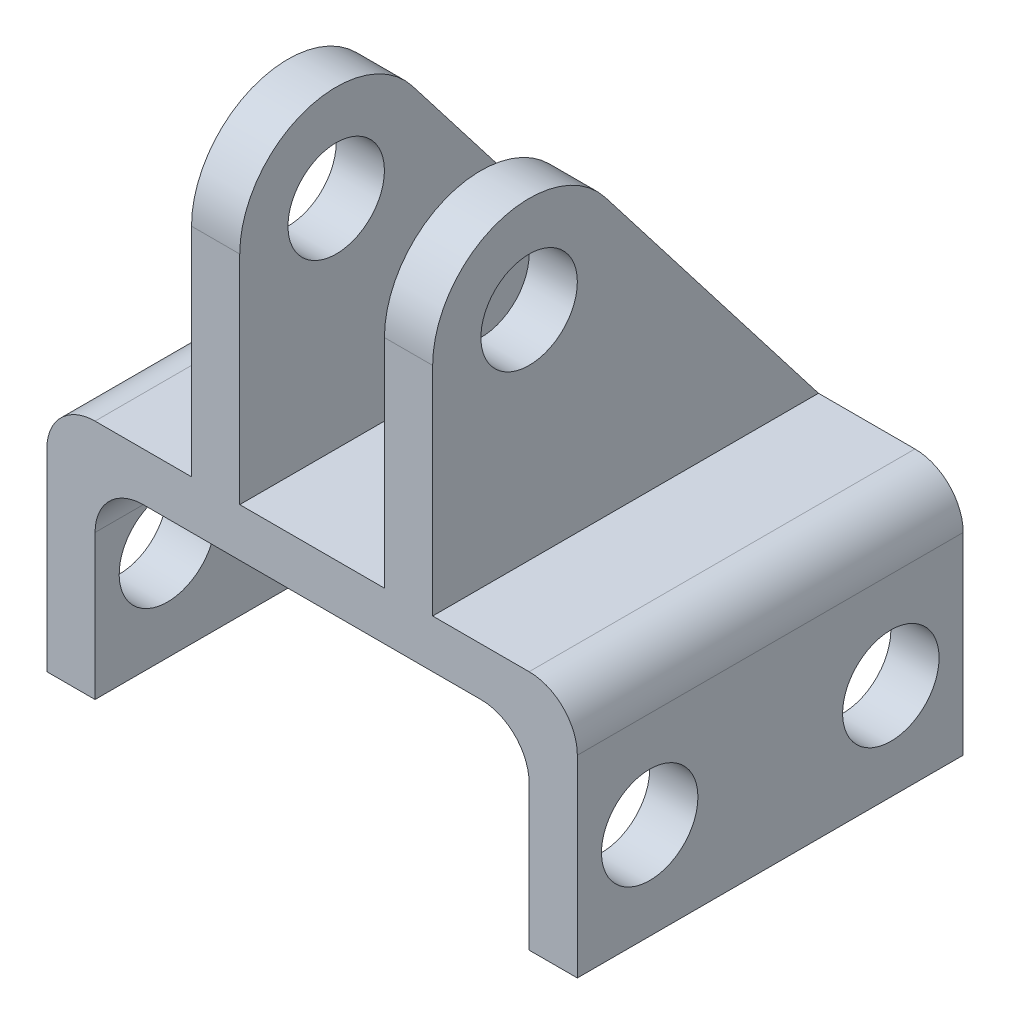
ISO-10303-21;
HEADER;
FILE_DESCRIPTION(('STEP AP214'),'2;1');
FILE_NAME('part.step','',(''),(''),'','','');
FILE_SCHEMA(('AUTOMOTIVE_DESIGN { 1 0 10303 214 1 1 1 1 }'));
ENDSEC;
DATA;
#1=APPLICATION_CONTEXT('core data for automotive mechanical design processes');
#2=APPLICATION_PROTOCOL_DEFINITION('international standard','automotive_design',2000,#1);
#3=PRODUCT_CONTEXT('',#1,'mechanical');
#4=PRODUCT('Part','Part','',(#3));
#5=PRODUCT_RELATED_PRODUCT_CATEGORY('part','',(#4));
#6=PRODUCT_DEFINITION_FORMATION('','',#4);
#7=PRODUCT_DEFINITION_CONTEXT('part definition',#1,'design');
#8=PRODUCT_DEFINITION('design','',#6,#7);
#9=PRODUCT_DEFINITION_SHAPE('','',#8);
#10=(LENGTH_UNIT() NAMED_UNIT(*) SI_UNIT(.MILLI.,.METRE.));
#11=(NAMED_UNIT(*) PLANE_ANGLE_UNIT() SI_UNIT($,.RADIAN.));
#12=(NAMED_UNIT(*) SI_UNIT($,.STERADIAN.) SOLID_ANGLE_UNIT());
#13=UNCERTAINTY_MEASURE_WITH_UNIT(LENGTH_MEASURE(1.E-05),#10,'distance_accuracy_value','');
#14=(GEOMETRIC_REPRESENTATION_CONTEXT(3) GLOBAL_UNCERTAINTY_ASSIGNED_CONTEXT((#13)) GLOBAL_UNIT_ASSIGNED_CONTEXT((#10,
#11,#12)) REPRESENTATION_CONTEXT('',''));
#15=CARTESIAN_POINT('',(0.,0.,0.));
#16=DIRECTION('',(0.,0.,1.));
#17=DIRECTION('',(1.,0.,0.));
#18=AXIS2_PLACEMENT_3D('',#15,#16,#17);
#19=CARTESIAN_POINT('',(-30.,0.,0.));
#20=DIRECTION('',(0.,-1.,0.));
#21=DIRECTION('',(0.,0.,-1.));
#22=AXIS2_PLACEMENT_3D('',#19,#20,#21);
#23=PLANE('',#22);
#24=DIRECTION('',(1.,0.,0.));
#25=VECTOR('',#24,1.);
#26=CARTESIAN_POINT('',(-30.,0.,-80.0000171327604));
#27=LINE('',#26,#25);
#28=CARTESIAN_POINT('',(-9.99999999999999,0.,-80.0000171327604));
#29=VERTEX_POINT('',#28);
#30=CARTESIAN_POINT('',(60.,0.,-80.0000171327604));
#31=VERTEX_POINT('',#30);
#32=EDGE_CURVE('E253',#29,#31,#27,.T.);
#33=ORIENTED_EDGE('',*,*,#32,.T.);
#34=DIRECTION('',(0.,0.,-1.));
#35=VECTOR('',#34,1.);
#36=CARTESIAN_POINT('',(60.,0.,0.));
#37=LINE('',#36,#35);
#38=CARTESIAN_POINT('',(60.,0.,0.));
#39=VERTEX_POINT('',#38);
#40=EDGE_CURVE('E321',#31,#39,#37,.F.);
#41=ORIENTED_EDGE('',*,*,#40,.T.);
#42=DIRECTION('',(1.,0.,0.));
#43=VECTOR('',#42,1.);
#44=CARTESIAN_POINT('',(-30.,0.,0.));
#45=LINE('',#44,#43);
#46=CARTESIAN_POINT('',(-9.99999999999999,0.,0.));
#47=VERTEX_POINT('',#46);
#48=EDGE_CURVE('E313',#47,#39,#45,.T.);
#49=ORIENTED_EDGE('',*,*,#48,.F.);
#50=DIRECTION('',(0.,0.,-1.));
#51=VECTOR('',#50,1.);
#52=CARTESIAN_POINT('',(-9.99999999999999,0.,-80.0000171327604));
#53=LINE('',#52,#51);
#54=EDGE_CURVE('E312',#47,#29,#53,.T.);
#55=ORIENTED_EDGE('',*,*,#54,.T.);
#56=EDGE_LOOP('',(#33,#41,#49,#55));
#57=FACE_BOUND('',#56,.T.);
#58=ADVANCED_FACE('F35',(#57),#23,.T.);
#59=CARTESIAN_POINT('',(10.,42.4293102479949,-54.9682409529749));
#60=DIRECTION('',(0.,-0.611031292742299,0.791606442172924));
#61=DIRECTION('',(0.,-0.791606442172924,-0.611031292742299));
#62=AXIS2_PLACEMENT_3D('',#59,#60,#61);
#63=PLANE('',#62);
#64=DIRECTION('',(0.,0.791606442172924,0.611031292742299));
#65=VECTOR('',#64,1.);
#66=CARTESIAN_POINT('',(0.,42.4293102479949,-54.9682409529749));
#67=LINE('',#66,#65);
#68=CARTESIAN_POINT('',(0.,10.0000132245674,-80.0000171327604));
#69=VERTEX_POINT('',#68);
#70=CARTESIAN_POINT('',(0.,67.220625854846,-35.8321288434585));
#71=VERTEX_POINT('',#70);
#72=EDGE_CURVE('E338',#69,#71,#67,.T.);
#73=ORIENTED_EDGE('',*,*,#72,.T.);
#74=DIRECTION('',(-1.,0.,0.));
#75=VECTOR('',#74,1.);
#76=CARTESIAN_POINT('',(10.,67.220625854846,-35.8321288434585));
#77=LINE('',#76,#75);
#78=CARTESIAN_POINT('',(10.,67.220625854846,-35.8321288434585));
#79=VERTEX_POINT('',#78);
#80=EDGE_CURVE('E272',#79,#71,#77,.T.);
#81=ORIENTED_EDGE('',*,*,#80,.F.);
#82=DIRECTION('',(0.,0.791606442172924,0.611031292742299));
#83=VECTOR('',#82,1.);
#84=CARTESIAN_POINT('',(10.,42.4293102479949,-54.9682409529749));
#85=LINE('',#84,#83);
#86=CARTESIAN_POINT('',(10.,10.0000132245674,-80.0000171327604));
#87=VERTEX_POINT('',#86);
#88=EDGE_CURVE('E257',#87,#79,#85,.T.);
#89=ORIENTED_EDGE('',*,*,#88,.F.);
#90=DIRECTION('',(-1.,0.,0.));
#91=VECTOR('',#90,1.);
#92=CARTESIAN_POINT('',(10.,10.0000132245674,-80.0000171327604));
#93=LINE('',#92,#91);
#94=EDGE_CURVE('E271',#87,#69,#93,.T.);
#95=ORIENTED_EDGE('',*,*,#94,.T.);
#96=EDGE_LOOP('',(#73,#81,#89,#95));
#97=FACE_BOUND('',#96,.T.);
#98=ADVANCED_FACE('F519',(#97),#63,.F.);
#99=CARTESIAN_POINT('',(10.,55.,-20.));
#100=DIRECTION('',(-1.,0.,0.));
#101=DIRECTION('',(0.,0.,1.));
#102=AXIS2_PLACEMENT_3D('',#99,#100,#101);
#103=CYLINDRICAL_SURFACE('',#102,20.);
#104=CARTESIAN_POINT('',(0.,55.,-20.));
#105=DIRECTION('',(1.,0.,0.));
#106=DIRECTION('',(0.,0.,-1.));
#107=AXIS2_PLACEMENT_3D('',#104,#105,#106);
#108=CIRCLE('',#107,20.);
#109=CARTESIAN_POINT('',(0.,55.,0.));
#110=VERTEX_POINT('',#109);
#111=EDGE_CURVE('E293',#71,#110,#108,.T.);
#112=ORIENTED_EDGE('',*,*,#111,.T.);
#113=DIRECTION('',(-1.,0.,0.));
#114=VECTOR('',#113,1.);
#115=CARTESIAN_POINT('',(10.,55.,0.));
#116=LINE('',#115,#114);
#117=CARTESIAN_POINT('',(10.,55.,0.));
#118=VERTEX_POINT('',#117);
#119=EDGE_CURVE('E276',#118,#110,#116,.T.);
#120=ORIENTED_EDGE('',*,*,#119,.F.);
#121=CARTESIAN_POINT('',(10.,55.,-20.));
#122=DIRECTION('',(1.,0.,0.));
#123=DIRECTION('',(0.,0.,-1.));
#124=AXIS2_PLACEMENT_3D('',#121,#122,#123);
#125=CIRCLE('',#124,20.);
#126=EDGE_CURVE('E259',#79,#118,#125,.T.);
#127=ORIENTED_EDGE('',*,*,#126,.F.);
#128=ORIENTED_EDGE('',*,*,#80,.T.);
#129=EDGE_LOOP('',(#112,#120,#127,#128));
#130=FACE_BOUND('',#129,.T.);
#131=ADVANCED_FACE('F526',(#130),#103,.T.);
#132=CARTESIAN_POINT('',(10.,0.,0.));
#133=DIRECTION('',(0.,0.,1.));
#134=DIRECTION('',(1.,0.,0.));
#135=AXIS2_PLACEMENT_3D('',#132,#133,#134);
#136=PLANE('',#135);
#137=DIRECTION('',(0.,1.,0.));
#138=VECTOR('',#137,1.);
#139=CARTESIAN_POINT('',(80.,0.,0.));
#140=LINE('',#139,#138);
#141=CARTESIAN_POINT('',(80.,-40.,0.));
#142=VERTEX_POINT('',#141);
#143=CARTESIAN_POINT('',(80.,1.32245673873516E-05,0.));
#144=VERTEX_POINT('',#143);
#145=EDGE_CURVE('E209',#142,#144,#140,.T.);
#146=ORIENTED_EDGE('',*,*,#145,.T.);
#147=CARTESIAN_POINT('',(70.,1.32245673873516E-05,0.));
#148=DIRECTION('',(0.,0.,1.));
#149=DIRECTION('',(1.,0.,0.));
#150=AXIS2_PLACEMENT_3D('',#147,#148,#149);
#151=CIRCLE('',#150,10.);
#152=CARTESIAN_POINT('',(70.,10.0000132245674,0.));
#153=VERTEX_POINT('',#152);
#154=EDGE_CURVE('E352',#144,#153,#151,.T.);
#155=ORIENTED_EDGE('',*,*,#154,.T.);
#156=DIRECTION('',(-1.,0.,0.));
#157=VECTOR('',#156,1.);
#158=CARTESIAN_POINT('',(80.,10.0000132245674,0.));
#159=LINE('',#158,#157);
#160=CARTESIAN_POINT('',(50.,10.0000132245674,0.));
#161=VERTEX_POINT('',#160);
#162=EDGE_CURVE('E225',#153,#161,#159,.T.);
#163=ORIENTED_EDGE('',*,*,#162,.T.);
#164=DIRECTION('',(0.,1.,0.));
#165=VECTOR('',#164,1.);
#166=CARTESIAN_POINT('',(50.,0.,0.));
#167=LINE('',#166,#165);
#168=CARTESIAN_POINT('',(50.,55.,0.));
#169=VERTEX_POINT('',#168);
#170=EDGE_CURVE('E452',#161,#169,#167,.T.);
#171=ORIENTED_EDGE('',*,*,#170,.T.);
#172=DIRECTION('',(1.,0.,0.));
#173=VECTOR('',#172,1.);
#174=CARTESIAN_POINT('',(40.,55.,0.));
#175=LINE('',#174,#173);
#176=CARTESIAN_POINT('',(40.,55.,0.));
#177=VERTEX_POINT('',#176);
#178=EDGE_CURVE('E465',#177,#169,#175,.T.);
#179=ORIENTED_EDGE('',*,*,#178,.F.);
#180=DIRECTION('',(0.,1.,0.));
#181=VECTOR('',#180,1.);
#182=CARTESIAN_POINT('',(40.,0.,0.));
#183=LINE('',#182,#181);
#184=CARTESIAN_POINT('',(40.,10.0000132245674,0.));
#185=VERTEX_POINT('',#184);
#186=EDGE_CURVE('E475',#185,#177,#183,.T.);
#187=ORIENTED_EDGE('',*,*,#186,.F.);
#188=DIRECTION('',(1.,0.,0.));
#189=VECTOR('',#188,1.);
#190=CARTESIAN_POINT('',(-30.,10.0000132245674,0.));
#191=LINE('',#190,#189);
#192=CARTESIAN_POINT('',(10.,10.0000132245674,0.));
#193=VERTEX_POINT('',#192);
#194=EDGE_CURVE('E239',#193,#185,#191,.T.);
#195=ORIENTED_EDGE('',*,*,#194,.F.);
#196=DIRECTION('',(0.,1.,0.));
#197=VECTOR('',#196,1.);
#198=CARTESIAN_POINT('',(10.,0.,0.));
#199=LINE('',#198,#197);
#200=EDGE_CURVE('E261',#193,#118,#199,.T.);
#201=ORIENTED_EDGE('',*,*,#200,.T.);
#202=ORIENTED_EDGE('',*,*,#119,.T.);
#203=DIRECTION('',(0.,1.,0.));
#204=VECTOR('',#203,1.);
#205=CARTESIAN_POINT('',(0.,0.,0.));
#206=LINE('',#205,#204);
#207=CARTESIAN_POINT('',(0.,10.0000132245674,0.));
#208=VERTEX_POINT('',#207);
#209=EDGE_CURVE('E290',#208,#110,#206,.T.);
#210=ORIENTED_EDGE('',*,*,#209,.F.);
#211=CARTESIAN_POINT('',(-20.,10.0000132245674,0.));
#212=VERTEX_POINT('',#211);
#213=EDGE_CURVE('E343',#212,#208,#191,.T.);
#214=ORIENTED_EDGE('',*,*,#213,.F.);
#215=CARTESIAN_POINT('',(-20.,1.32245673873516E-05,0.));
#216=DIRECTION('',(0.,0.,1.));
#217=DIRECTION('',(1.,0.,0.));
#218=AXIS2_PLACEMENT_3D('',#215,#216,#217);
#219=CIRCLE('',#218,10.);
#220=CARTESIAN_POINT('',(-30.,1.32245673873516E-05,0.));
#221=VERTEX_POINT('',#220);
#222=EDGE_CURVE('E50',#212,#221,#219,.T.);
#223=ORIENTED_EDGE('',*,*,#222,.T.);
#224=DIRECTION('',(0.,1.,0.));
#225=VECTOR('',#224,1.);
#226=CARTESIAN_POINT('',(-30.,0.,0.));
#227=LINE('',#226,#225);
#228=CARTESIAN_POINT('',(-30.,-40.,0.));
#229=VERTEX_POINT('',#228);
#230=EDGE_CURVE('E422',#229,#221,#227,.T.);
#231=ORIENTED_EDGE('',*,*,#230,.F.);
#232=DIRECTION('',(-1.,0.,0.));
#233=VECTOR('',#232,1.);
#234=CARTESIAN_POINT('',(-20.,-40.,0.));
#235=LINE('',#234,#233);
#236=CARTESIAN_POINT('',(-20.,-40.,0.));
#237=VERTEX_POINT('',#236);
#238=EDGE_CURVE('E386',#237,#229,#235,.T.);
#239=ORIENTED_EDGE('',*,*,#238,.F.);
#240=DIRECTION('',(0.,-1.,0.));
#241=VECTOR('',#240,1.);
#242=CARTESIAN_POINT('',(-20.,0.,0.));
#243=LINE('',#242,#241);
#244=CARTESIAN_POINT('',(-20.,-10.,0.));
#245=VERTEX_POINT('',#244);
#246=EDGE_CURVE('E324',#245,#237,#243,.T.);
#247=ORIENTED_EDGE('',*,*,#246,.F.);
#248=CARTESIAN_POINT('',(-9.99999999999999,-10.,0.));
#249=DIRECTION('',(0.,0.,1.));
#250=DIRECTION('',(1.,0.,0.));
#251=AXIS2_PLACEMENT_3D('',#248,#249,#250);
#252=CIRCLE('',#251,10.);
#253=EDGE_CURVE('E11',#245,#47,#252,.F.);
#254=ORIENTED_EDGE('',*,*,#253,.T.);
#255=ORIENTED_EDGE('',*,*,#48,.T.);
#256=CARTESIAN_POINT('',(60.,-10.,0.));
#257=DIRECTION('',(0.,0.,1.));
#258=DIRECTION('',(1.,0.,0.));
#259=AXIS2_PLACEMENT_3D('',#256,#257,#258);
#260=CIRCLE('',#259,10.);
#261=CARTESIAN_POINT('',(70.,-10.,0.));
#262=VERTEX_POINT('',#261);
#263=EDGE_CURVE('E191',#39,#262,#260,.F.);
#264=ORIENTED_EDGE('',*,*,#263,.T.);
#265=DIRECTION('',(0.,-1.,0.));
#266=VECTOR('',#265,1.);
#267=CARTESIAN_POINT('',(70.,0.,0.));
#268=LINE('',#267,#266);
#269=CARTESIAN_POINT('',(70.,-40.,0.));
#270=VERTEX_POINT('',#269);
#271=EDGE_CURVE('E183',#262,#270,#268,.T.);
#272=ORIENTED_EDGE('',*,*,#271,.T.);
#273=DIRECTION('',(1.,0.,0.));
#274=VECTOR('',#273,1.);
#275=CARTESIAN_POINT('',(70.,-40.,0.));
#276=LINE('',#275,#274);
#277=EDGE_CURVE('E188',#270,#142,#276,.T.);
#278=ORIENTED_EDGE('',*,*,#277,.T.);
#279=EDGE_LOOP('',(#146,#155,#163,#171,#179,#187,#195,#201,#202,#210,#214,#223,#231,#239,#247,
#254,#255,#264,#272,#278));
#280=FACE_BOUND('',#279,.T.);
#281=ADVANCED_FACE('F186',(#280),#136,.T.);
#282=CARTESIAN_POINT('',(10.,55.,-20.));
#283=DIRECTION('',(-1.,0.,0.));
#284=DIRECTION('',(0.,0.,1.));
#285=AXIS2_PLACEMENT_3D('',#282,#283,#284);
#286=CYLINDRICAL_SURFACE('',#285,10.);
#287=CARTESIAN_POINT('',(10.,55.,-20.));
#288=DIRECTION('',(1.,0.,0.));
#289=DIRECTION('',(0.,0.,-1.));
#290=AXIS2_PLACEMENT_3D('',#287,#288,#289);
#291=CIRCLE('',#290,10.);
#292=CARTESIAN_POINT('',(10.,55.,-30.));
#293=VERTEX_POINT('',#292);
#294=EDGE_CURVE('E254',#293,#293,#291,.T.);
#295=ORIENTED_EDGE('',*,*,#294,.T.);
#296=EDGE_LOOP('',(#295));
#297=FACE_BOUND('',#296,.T.);
#298=CARTESIAN_POINT('',(0.,55.,-20.));
#299=DIRECTION('',(1.,0.,0.));
#300=DIRECTION('',(0.,0.,-1.));
#301=AXIS2_PLACEMENT_3D('',#298,#299,#300);
#302=CIRCLE('',#301,10.);
#303=CARTESIAN_POINT('',(0.,55.,-30.));
#304=VERTEX_POINT('',#303);
#305=EDGE_CURVE('E264',#304,#304,#302,.T.);
#306=ORIENTED_EDGE('',*,*,#305,.F.);
#307=EDGE_LOOP('',(#306));
#308=FACE_BOUND('',#307,.T.);
#309=ADVANCED_FACE('F535',(#297,#308),#286,.F.);
#310=CARTESIAN_POINT('',(10.,0.,0.));
#311=DIRECTION('',(1.,0.,0.));
#312=DIRECTION('',(0.,0.,-1.));
#313=AXIS2_PLACEMENT_3D('',#310,#311,#312);
#314=PLANE('',#313);
#315=ORIENTED_EDGE('',*,*,#294,.F.);
#316=EDGE_LOOP('',(#315));
#317=FACE_BOUND('',#316,.T.);
#318=ORIENTED_EDGE('',*,*,#88,.T.);
#319=ORIENTED_EDGE('',*,*,#126,.T.);
#320=ORIENTED_EDGE('',*,*,#200,.F.);
#321=DIRECTION('',(0.,0.,-1.));
#322=VECTOR('',#321,1.);
#323=CARTESIAN_POINT('',(10.,10.0000132245674,0.));
#324=LINE('',#323,#322);
#325=EDGE_CURVE('E267',#193,#87,#324,.T.);
#326=ORIENTED_EDGE('',*,*,#325,.T.);
#327=EDGE_LOOP('',(#318,#319,#320,#326));
#328=FACE_BOUND('',#327,.T.);
#329=ADVANCED_FACE('F531',(#317,#328),#314,.T.);
#330=CARTESIAN_POINT('',(0.,0.,0.));
#331=DIRECTION('',(1.,0.,0.));
#332=DIRECTION('',(0.,0.,-1.));
#333=AXIS2_PLACEMENT_3D('',#330,#331,#332);
#334=PLANE('',#333);
#335=ORIENTED_EDGE('',*,*,#305,.T.);
#336=EDGE_LOOP('',(#335));
#337=FACE_BOUND('',#336,.T.);
#338=ORIENTED_EDGE('',*,*,#72,.F.);
#339=DIRECTION('',(0.,0.,-1.));
#340=VECTOR('',#339,1.);
#341=CARTESIAN_POINT('',(0.,10.0000132245674,0.));
#342=LINE('',#341,#340);
#343=EDGE_CURVE('E258',#208,#69,#342,.T.);
#344=ORIENTED_EDGE('',*,*,#343,.F.);
#345=ORIENTED_EDGE('',*,*,#209,.T.);
#346=ORIENTED_EDGE('',*,*,#111,.F.);
#347=EDGE_LOOP('',(#338,#344,#345,#346));
#348=FACE_BOUND('',#347,.T.);
#349=ADVANCED_FACE('F534',(#337,#348),#334,.F.);
#350=CARTESIAN_POINT('',(-30.,10.0000132245674,0.));
#351=DIRECTION('',(0.,-1.,0.));
#352=DIRECTION('',(0.,0.,-1.));
#353=AXIS2_PLACEMENT_3D('',#350,#351,#352);
#354=PLANE('',#353);
#355=DIRECTION('',(1.,0.,0.));
#356=VECTOR('',#355,1.);
#357=CARTESIAN_POINT('',(-30.,10.0000132245674,-80.0000171327604));
#358=LINE('',#357,#356);
#359=CARTESIAN_POINT('',(-20.,10.0000132245674,-80.0000171327604));
#360=VERTEX_POINT('',#359);
#361=EDGE_CURVE('E236',#360,#69,#358,.T.);
#362=ORIENTED_EDGE('',*,*,#361,.F.);
#363=DIRECTION('',(0.,0.,-1.));
#364=VECTOR('',#363,1.);
#365=CARTESIAN_POINT('',(-20.,10.0000132245674,0.));
#366=LINE('',#365,#364);
#367=EDGE_CURVE('E58',#360,#212,#366,.F.);
#368=ORIENTED_EDGE('',*,*,#367,.T.);
#369=ORIENTED_EDGE('',*,*,#213,.T.);
#370=ORIENTED_EDGE('',*,*,#343,.T.);
#371=EDGE_LOOP('',(#362,#368,#369,#370));
#372=FACE_BOUND('',#371,.T.);
#373=ADVANCED_FACE('F416',(#372),#354,.F.);
#374=ORIENTED_EDGE('',*,*,#325,.F.);
#375=ORIENTED_EDGE('',*,*,#194,.T.);
#376=DIRECTION('',(0.,0.,-1.));
#377=VECTOR('',#376,1.);
#378=CARTESIAN_POINT('',(40.,10.0000132245674,0.));
#379=LINE('',#378,#377);
#380=CARTESIAN_POINT('',(40.,10.0000132245674,-80.0000171327604));
#381=VERTEX_POINT('',#380);
#382=EDGE_CURVE('E471',#185,#381,#379,.T.);
#383=ORIENTED_EDGE('',*,*,#382,.T.);
#384=EDGE_CURVE('E240',#87,#381,#358,.T.);
#385=ORIENTED_EDGE('',*,*,#384,.F.);
#386=EDGE_LOOP('',(#374,#375,#383,#385));
#387=FACE_BOUND('',#386,.T.);
#388=ADVANCED_FACE('F591',(#387),#354,.F.);
#389=CARTESIAN_POINT('',(-30.,0.,-80.0000171327604));
#390=DIRECTION('',(0.,0.,-1.));
#391=DIRECTION('',(-1.,0.,0.));
#392=AXIS2_PLACEMENT_3D('',#389,#390,#391);
#393=PLANE('',#392);
#394=DIRECTION('',(-1.,0.,0.));
#395=VECTOR('',#394,1.);
#396=CARTESIAN_POINT('',(80.,10.0000132245674,-80.0000171327604));
#397=LINE('',#396,#395);
#398=CARTESIAN_POINT('',(70.,10.0000132245674,-80.0000171327604));
#399=VERTEX_POINT('',#398);
#400=CARTESIAN_POINT('',(50.,10.0000132245674,-80.0000171327604));
#401=VERTEX_POINT('',#400);
#402=EDGE_CURVE('E219',#399,#401,#397,.T.);
#403=ORIENTED_EDGE('',*,*,#402,.F.);
#404=CARTESIAN_POINT('',(70.,1.32245673873516E-05,-80.0000171327604));
#405=DIRECTION('',(0.,0.,-1.));
#406=DIRECTION('',(-1.,0.,0.));
#407=AXIS2_PLACEMENT_3D('',#404,#405,#406);
#408=CIRCLE('',#407,10.);
#409=CARTESIAN_POINT('',(80.,1.32245673873516E-05,-80.0000171327604));
#410=VERTEX_POINT('',#409);
#411=EDGE_CURVE('E409',#399,#410,#408,.T.);
#412=ORIENTED_EDGE('',*,*,#411,.T.);
#413=DIRECTION('',(0.,1.,0.));
#414=VECTOR('',#413,1.);
#415=CARTESIAN_POINT('',(80.,0.,-80.0000171327604));
#416=LINE('',#415,#414);
#417=CARTESIAN_POINT('',(80.,-40.,-80.0000171327604));
#418=VERTEX_POINT('',#417);
#419=EDGE_CURVE('E212',#418,#410,#416,.T.);
#420=ORIENTED_EDGE('',*,*,#419,.F.);
#421=DIRECTION('',(1.,0.,0.));
#422=VECTOR('',#421,1.);
#423=CARTESIAN_POINT('',(70.,-40.,-80.0000171327604));
#424=LINE('',#423,#422);
#425=CARTESIAN_POINT('',(70.,-40.,-80.0000171327604));
#426=VERTEX_POINT('',#425);
#427=EDGE_CURVE('E210',#426,#418,#424,.T.);
#428=ORIENTED_EDGE('',*,*,#427,.F.);
#429=DIRECTION('',(0.,1.,0.));
#430=VECTOR('',#429,1.);
#431=CARTESIAN_POINT('',(70.,0.,-80.0000171327604));
#432=LINE('',#431,#430);
#433=CARTESIAN_POINT('',(70.,-10.,-80.0000171327604));
#434=VERTEX_POINT('',#433);
#435=EDGE_CURVE('E201',#426,#434,#432,.T.);
#436=ORIENTED_EDGE('',*,*,#435,.T.);
#437=CARTESIAN_POINT('',(60.,-10.,-80.0000171327604));
#438=DIRECTION('',(0.,0.,-1.));
#439=DIRECTION('',(-1.,0.,0.));
#440=AXIS2_PLACEMENT_3D('',#437,#438,#439);
#441=CIRCLE('',#440,10.);
#442=EDGE_CURVE('E358',#434,#31,#441,.F.);
#443=ORIENTED_EDGE('',*,*,#442,.T.);
#444=ORIENTED_EDGE('',*,*,#32,.F.);
#445=CARTESIAN_POINT('',(-9.99999999999999,-10.,-80.0000171327604));
#446=DIRECTION('',(0.,0.,-1.));
#447=DIRECTION('',(-1.,0.,0.));
#448=AXIS2_PLACEMENT_3D('',#445,#446,#447);
#449=CIRCLE('',#448,10.);
#450=CARTESIAN_POINT('',(-20.,-10.,-80.0000171327604));
#451=VERTEX_POINT('',#450);
#452=EDGE_CURVE('E43',#29,#451,#449,.F.);
#453=ORIENTED_EDGE('',*,*,#452,.T.);
#454=DIRECTION('',(0.,1.,0.));
#455=VECTOR('',#454,1.);
#456=CARTESIAN_POINT('',(-20.,0.,-80.0000171327604));
#457=LINE('',#456,#455);
#458=CARTESIAN_POINT('',(-20.,-40.,-80.0000171327604));
#459=VERTEX_POINT('',#458);
#460=EDGE_CURVE('E332',#459,#451,#457,.T.);
#461=ORIENTED_EDGE('',*,*,#460,.F.);
#462=DIRECTION('',(-1.,0.,0.));
#463=VECTOR('',#462,1.);
#464=CARTESIAN_POINT('',(-20.,-40.,-80.0000171327604));
#465=LINE('',#464,#463);
#466=CARTESIAN_POINT('',(-30.,-40.,-80.0000171327604));
#467=VERTEX_POINT('',#466);
#468=EDGE_CURVE('E335',#459,#467,#465,.T.);
#469=ORIENTED_EDGE('',*,*,#468,.T.);
#470=DIRECTION('',(0.,1.,0.));
#471=VECTOR('',#470,1.);
#472=CARTESIAN_POINT('',(-30.,0.,-80.0000171327604));
#473=LINE('',#472,#471);
#474=CARTESIAN_POINT('',(-30.,1.32245673873516E-05,-80.0000171327604));
#475=VERTEX_POINT('',#474);
#476=EDGE_CURVE('E315',#467,#475,#473,.T.);
#477=ORIENTED_EDGE('',*,*,#476,.T.);
#478=CARTESIAN_POINT('',(-20.,1.32245673873516E-05,-80.0000171327604));
#479=DIRECTION('',(0.,0.,-1.));
#480=DIRECTION('',(-1.,0.,0.));
#481=AXIS2_PLACEMENT_3D('',#478,#479,#480);
#482=CIRCLE('',#481,10.);
#483=EDGE_CURVE('E235',#475,#360,#482,.T.);
#484=ORIENTED_EDGE('',*,*,#483,.T.);
#485=ORIENTED_EDGE('',*,*,#361,.T.);
#486=ORIENTED_EDGE('',*,*,#94,.F.);
#487=ORIENTED_EDGE('',*,*,#384,.T.);
#488=DIRECTION('',(1.,0.,0.));
#489=VECTOR('',#488,1.);
#490=CARTESIAN_POINT('',(40.,10.0000132245674,-80.0000171327604));
#491=LINE('',#490,#489);
#492=EDGE_CURVE('E468',#381,#401,#491,.T.);
#493=ORIENTED_EDGE('',*,*,#492,.T.);
#494=EDGE_LOOP('',(#403,#412,#420,#428,#436,#443,#444,#453,#461,#469,#477,#484,#485,#486,#487,#493));
#495=FACE_BOUND('',#494,.T.);
#496=ADVANCED_FACE('F364',(#495),#393,.T.);
#497=CARTESIAN_POINT('',(-30.,0.,0.));
#498=DIRECTION('',(1.,0.,0.));
#499=DIRECTION('',(0.,0.,-1.));
#500=AXIS2_PLACEMENT_3D('',#497,#498,#499);
#501=PLANE('',#500);
#502=ORIENTED_EDGE('',*,*,#230,.T.);
#503=DIRECTION('',(0.,0.,-1.));
#504=VECTOR('',#503,1.);
#505=CARTESIAN_POINT('',(-30.,1.32245673873516E-05,0.));
#506=LINE('',#505,#504);
#507=EDGE_CURVE('E354',#221,#475,#506,.T.);
#508=ORIENTED_EDGE('',*,*,#507,.T.);
#509=ORIENTED_EDGE('',*,*,#476,.F.);
#510=DIRECTION('',(0.,0.,-1.));
#511=VECTOR('',#510,1.);
#512=CARTESIAN_POINT('',(-30.,-40.,0.));
#513=LINE('',#512,#511);
#514=EDGE_CURVE('E423',#229,#467,#513,.T.);
#515=ORIENTED_EDGE('',*,*,#514,.F.);
#516=EDGE_LOOP('',(#502,#508,#509,#515));
#517=FACE_BOUND('',#516,.T.);
#518=CARTESIAN_POINT('',(-30.,-20.,-65.));
#519=DIRECTION('',(1.,0.,0.));
#520=DIRECTION('',(0.,0.,-1.));
#521=AXIS2_PLACEMENT_3D('',#518,#519,#520);
#522=CIRCLE('',#521,9.99999999999999);
#523=CARTESIAN_POINT('',(-30.,-20.,-75.));
#524=VERTEX_POINT('',#523);
#525=EDGE_CURVE('E433',#524,#524,#522,.T.);
#526=ORIENTED_EDGE('',*,*,#525,.T.);
#527=EDGE_LOOP('',(#526));
#528=FACE_BOUND('',#527,.T.);
#529=CARTESIAN_POINT('',(-30.,-20.,-15.));
#530=DIRECTION('',(1.,0.,0.));
#531=DIRECTION('',(0.,0.,-1.));
#532=AXIS2_PLACEMENT_3D('',#529,#530,#531);
#533=CIRCLE('',#532,10.);
#534=CARTESIAN_POINT('',(-30.,-20.,-25.));
#535=VERTEX_POINT('',#534);
#536=EDGE_CURVE('E430',#535,#535,#533,.T.);
#537=ORIENTED_EDGE('',*,*,#536,.T.);
#538=EDGE_LOOP('',(#537));
#539=FACE_BOUND('',#538,.T.);
#540=ADVANCED_FACE('F418',(#517,#528,#539),#501,.F.);
#541=CARTESIAN_POINT('',(-20.,-40.,0.));
#542=DIRECTION('',(0.,1.,0.));
#543=DIRECTION('',(0.,0.,1.));
#544=AXIS2_PLACEMENT_3D('',#541,#542,#543);
#545=PLANE('',#544);
#546=ORIENTED_EDGE('',*,*,#514,.T.);
#547=ORIENTED_EDGE('',*,*,#468,.F.);
#548=DIRECTION('',(0.,0.,-1.));
#549=VECTOR('',#548,1.);
#550=CARTESIAN_POINT('',(-20.,-40.,0.));
#551=LINE('',#550,#549);
#552=EDGE_CURVE('E326',#237,#459,#551,.T.);
#553=ORIENTED_EDGE('',*,*,#552,.F.);
#554=ORIENTED_EDGE('',*,*,#238,.T.);
#555=EDGE_LOOP('',(#546,#547,#553,#554));
#556=FACE_BOUND('',#555,.T.);
#557=ADVANCED_FACE('F579',(#556),#545,.F.);
#558=CARTESIAN_POINT('',(-20.,-20.,-15.));
#559=DIRECTION('',(-1.,0.,0.));
#560=DIRECTION('',(0.,0.,1.));
#561=AXIS2_PLACEMENT_3D('',#558,#559,#560);
#562=CYLINDRICAL_SURFACE('',#561,10.);
#563=CARTESIAN_POINT('',(-20.,-20.,-15.));
#564=DIRECTION('',(1.,0.,0.));
#565=DIRECTION('',(0.,0.,-1.));
#566=AXIS2_PLACEMENT_3D('',#563,#564,#565);
#567=CIRCLE('',#566,10.);
#568=CARTESIAN_POINT('',(-20.,-10.,-15.));
#569=VERTEX_POINT('',#568);
#570=EDGE_CURVE('E327',#569,#569,#567,.T.);
#571=ORIENTED_EDGE('',*,*,#570,.T.);
#572=EDGE_LOOP('',(#571));
#573=FACE_BOUND('',#572,.T.);
#574=ORIENTED_EDGE('',*,*,#536,.F.);
#575=EDGE_LOOP('',(#574));
#576=FACE_BOUND('',#575,.T.);
#577=ADVANCED_FACE('F582',(#573,#576),#562,.F.);
#578=CARTESIAN_POINT('',(-20.,-20.,-65.));
#579=DIRECTION('',(-1.,0.,0.));
#580=DIRECTION('',(0.,0.,1.));
#581=AXIS2_PLACEMENT_3D('',#578,#579,#580);
#582=CYLINDRICAL_SURFACE('',#581,9.99999999999999);
#583=CARTESIAN_POINT('',(-20.,-20.,-65.));
#584=DIRECTION('',(1.,0.,0.));
#585=DIRECTION('',(0.,0.,-1.));
#586=AXIS2_PLACEMENT_3D('',#583,#584,#585);
#587=CIRCLE('',#586,9.99999999999999);
#588=CARTESIAN_POINT('',(-20.,-10.,-65.));
#589=VERTEX_POINT('',#588);
#590=EDGE_CURVE('E429',#589,#589,#587,.T.);
#591=ORIENTED_EDGE('',*,*,#590,.T.);
#592=EDGE_LOOP('',(#591));
#593=FACE_BOUND('',#592,.T.);
#594=ORIENTED_EDGE('',*,*,#525,.F.);
#595=EDGE_LOOP('',(#594));
#596=FACE_BOUND('',#595,.T.);
#597=ADVANCED_FACE('F578',(#593,#596),#582,.F.);
#598=CARTESIAN_POINT('',(-20.,0.,0.));
#599=DIRECTION('',(1.,0.,0.));
#600=DIRECTION('',(0.,0.,-1.));
#601=AXIS2_PLACEMENT_3D('',#598,#599,#600);
#602=PLANE('',#601);
#603=ORIENTED_EDGE('',*,*,#460,.T.);
#604=DIRECTION('',(0.,0.,-1.));
#605=VECTOR('',#604,1.);
#606=CARTESIAN_POINT('',(-20.,-10.,0.));
#607=LINE('',#606,#605);
#608=EDGE_CURVE('E229',#451,#589,#607,.F.);
#609=ORIENTED_EDGE('',*,*,#608,.T.);
#610=ORIENTED_EDGE('',*,*,#590,.F.);
#611=DIRECTION('',(0.,0.,-1.));
#612=VECTOR('',#611,1.);
#613=CARTESIAN_POINT('',(-20.,-10.,0.));
#614=LINE('',#613,#612);
#615=EDGE_CURVE('E378',#589,#569,#614,.F.);
#616=ORIENTED_EDGE('',*,*,#615,.T.);
#617=ORIENTED_EDGE('',*,*,#570,.F.);
#618=DIRECTION('',(0.,0.,-1.));
#619=VECTOR('',#618,1.);
#620=CARTESIAN_POINT('',(-20.,-10.,0.));
#621=LINE('',#620,#619);
#622=EDGE_CURVE('E323',#569,#245,#621,.F.);
#623=ORIENTED_EDGE('',*,*,#622,.T.);
#624=ORIENTED_EDGE('',*,*,#246,.T.);
#625=ORIENTED_EDGE('',*,*,#552,.T.);
#626=EDGE_LOOP('',(#603,#609,#610,#616,#617,#623,#624,#625));
#627=FACE_BOUND('',#626,.T.);
#628=ADVANCED_FACE('F370',(#627),#602,.T.);
#629=CARTESIAN_POINT('',(40.,42.4293102479949,-54.9682409529749));
#630=DIRECTION('',(0.,-0.611031292742299,0.791606442172924));
#631=DIRECTION('',(0.,-0.791606442172924,-0.611031292742299));
#632=AXIS2_PLACEMENT_3D('',#629,#630,#631);
#633=PLANE('',#632);
#634=DIRECTION('',(0.,0.791606442172924,0.611031292742299));
#635=VECTOR('',#634,1.);
#636=CARTESIAN_POINT('',(50.,42.4293102479949,-54.9682409529749));
#637=LINE('',#636,#635);
#638=CARTESIAN_POINT('',(50.,67.220625854846,-35.8321288434585));
#639=VERTEX_POINT('',#638);
#640=EDGE_CURVE('E446',#401,#639,#637,.T.);
#641=ORIENTED_EDGE('',*,*,#640,.F.);
#642=ORIENTED_EDGE('',*,*,#492,.F.);
#643=DIRECTION('',(0.,0.791606442172924,0.611031292742299));
#644=VECTOR('',#643,1.);
#645=CARTESIAN_POINT('',(40.,42.4293102479949,-54.9682409529749));
#646=LINE('',#645,#644);
#647=CARTESIAN_POINT('',(40.,67.220625854846,-35.8321288434585));
#648=VERTEX_POINT('',#647);
#649=EDGE_CURVE('E501',#381,#648,#646,.T.);
#650=ORIENTED_EDGE('',*,*,#649,.T.);
#651=DIRECTION('',(1.,0.,0.));
#652=VECTOR('',#651,1.);
#653=CARTESIAN_POINT('',(40.,67.220625854846,-35.8321288434585));
#654=LINE('',#653,#652);
#655=EDGE_CURVE('E436',#648,#639,#654,.T.);
#656=ORIENTED_EDGE('',*,*,#655,.T.);
#657=EDGE_LOOP('',(#641,#642,#650,#656));
#658=FACE_BOUND('',#657,.T.);
#659=ADVANCED_FACE('F497',(#658),#633,.F.);
#660=CARTESIAN_POINT('',(40.,55.,-20.));
#661=DIRECTION('',(1.,0.,0.));
#662=DIRECTION('',(0.,0.,1.));
#663=AXIS2_PLACEMENT_3D('',#660,#661,#662);
#664=CYLINDRICAL_SURFACE('',#663,20.);
#665=CARTESIAN_POINT('',(50.,55.,-20.));
#666=DIRECTION('',(1.,0.,0.));
#667=DIRECTION('',(0.,0.,-1.));
#668=AXIS2_PLACEMENT_3D('',#665,#666,#667);
#669=CIRCLE('',#668,20.);
#670=EDGE_CURVE('E449',#639,#169,#669,.T.);
#671=ORIENTED_EDGE('',*,*,#670,.F.);
#672=ORIENTED_EDGE('',*,*,#655,.F.);
#673=CARTESIAN_POINT('',(40.,55.,-20.));
#674=DIRECTION('',(1.,0.,0.));
#675=DIRECTION('',(0.,0.,-1.));
#676=AXIS2_PLACEMENT_3D('',#673,#674,#675);
#677=CIRCLE('',#676,20.);
#678=EDGE_CURVE('E479',#648,#177,#677,.T.);
#679=ORIENTED_EDGE('',*,*,#678,.T.);
#680=ORIENTED_EDGE('',*,*,#178,.T.);
#681=EDGE_LOOP('',(#671,#672,#679,#680));
#682=FACE_BOUND('',#681,.T.);
#683=ADVANCED_FACE('F504',(#682),#664,.T.);
#684=CARTESIAN_POINT('',(40.,55.,-20.));
#685=DIRECTION('',(1.,0.,0.));
#686=DIRECTION('',(0.,0.,1.));
#687=AXIS2_PLACEMENT_3D('',#684,#685,#686);
#688=CYLINDRICAL_SURFACE('',#687,10.);
#689=CARTESIAN_POINT('',(40.,55.,-20.));
#690=DIRECTION('',(1.,0.,0.));
#691=DIRECTION('',(0.,0.,-1.));
#692=AXIS2_PLACEMENT_3D('',#689,#690,#691);
#693=CIRCLE('',#692,10.);
#694=CARTESIAN_POINT('',(40.,55.,-30.));
#695=VERTEX_POINT('',#694);
#696=EDGE_CURVE('E458',#695,#695,#693,.T.);
#697=ORIENTED_EDGE('',*,*,#696,.F.);
#698=EDGE_LOOP('',(#697));
#699=FACE_BOUND('',#698,.T.);
#700=CARTESIAN_POINT('',(50.,55.,-20.));
#701=DIRECTION('',(1.,0.,0.));
#702=DIRECTION('',(0.,0.,-1.));
#703=AXIS2_PLACEMENT_3D('',#700,#701,#702);
#704=CIRCLE('',#703,10.);
#705=CARTESIAN_POINT('',(50.,55.,-30.));
#706=VERTEX_POINT('',#705);
#707=EDGE_CURVE('E228',#706,#706,#704,.T.);
#708=ORIENTED_EDGE('',*,*,#707,.T.);
#709=EDGE_LOOP('',(#708));
#710=FACE_BOUND('',#709,.T.);
#711=ADVANCED_FACE('F483',(#699,#710),#688,.F.);
#712=CARTESIAN_POINT('',(40.,0.,0.));
#713=DIRECTION('',(-1.,0.,0.));
#714=DIRECTION('',(0.,0.,-1.));
#715=AXIS2_PLACEMENT_3D('',#712,#713,#714);
#716=PLANE('',#715);
#717=ORIENTED_EDGE('',*,*,#696,.T.);
#718=EDGE_LOOP('',(#717));
#719=FACE_BOUND('',#718,.T.);
#720=ORIENTED_EDGE('',*,*,#649,.F.);
#721=ORIENTED_EDGE('',*,*,#382,.F.);
#722=ORIENTED_EDGE('',*,*,#186,.T.);
#723=ORIENTED_EDGE('',*,*,#678,.F.);
#724=EDGE_LOOP('',(#720,#721,#722,#723));
#725=FACE_BOUND('',#724,.T.);
#726=ADVANCED_FACE('F489',(#719,#725),#716,.T.);
#727=CARTESIAN_POINT('',(50.,0.,0.));
#728=DIRECTION('',(-1.,0.,0.));
#729=DIRECTION('',(0.,0.,-1.));
#730=AXIS2_PLACEMENT_3D('',#727,#728,#729);
#731=PLANE('',#730);
#732=ORIENTED_EDGE('',*,*,#707,.F.);
#733=EDGE_LOOP('',(#732));
#734=FACE_BOUND('',#733,.T.);
#735=ORIENTED_EDGE('',*,*,#640,.T.);
#736=ORIENTED_EDGE('',*,*,#670,.T.);
#737=ORIENTED_EDGE('',*,*,#170,.F.);
#738=DIRECTION('',(0.,0.,-1.));
#739=VECTOR('',#738,1.);
#740=CARTESIAN_POINT('',(50.,10.0000132245674,0.));
#741=LINE('',#740,#739);
#742=EDGE_CURVE('E454',#161,#401,#741,.T.);
#743=ORIENTED_EDGE('',*,*,#742,.T.);
#744=EDGE_LOOP('',(#735,#736,#737,#743));
#745=FACE_BOUND('',#744,.T.);
#746=ADVANCED_FACE('F485',(#734,#745),#731,.F.);
#747=CARTESIAN_POINT('',(80.,10.0000132245674,0.));
#748=DIRECTION('',(0.,-1.,0.));
#749=DIRECTION('',(0.,0.,-1.));
#750=AXIS2_PLACEMENT_3D('',#747,#748,#749);
#751=PLANE('',#750);
#752=ORIENTED_EDGE('',*,*,#162,.F.);
#753=DIRECTION('',(0.,0.,-1.));
#754=VECTOR('',#753,1.);
#755=CARTESIAN_POINT('',(70.,10.0000132245674,0.));
#756=LINE('',#755,#754);
#757=EDGE_CURVE('E232',#153,#399,#756,.T.);
#758=ORIENTED_EDGE('',*,*,#757,.T.);
#759=ORIENTED_EDGE('',*,*,#402,.T.);
#760=ORIENTED_EDGE('',*,*,#742,.F.);
#761=EDGE_LOOP('',(#752,#758,#759,#760));
#762=FACE_BOUND('',#761,.T.);
#763=ADVANCED_FACE('F488',(#762),#751,.F.);
#764=CARTESIAN_POINT('',(80.,0.,0.));
#765=DIRECTION('',(-1.,0.,0.));
#766=DIRECTION('',(0.,0.,-1.));
#767=AXIS2_PLACEMENT_3D('',#764,#765,#766);
#768=PLANE('',#767);
#769=ORIENTED_EDGE('',*,*,#419,.T.);
#770=DIRECTION('',(0.,0.,-1.));
#771=VECTOR('',#770,1.);
#772=CARTESIAN_POINT('',(80.,1.32245673873516E-05,0.));
#773=LINE('',#772,#771);
#774=EDGE_CURVE('E350',#410,#144,#773,.F.);
#775=ORIENTED_EDGE('',*,*,#774,.T.);
#776=ORIENTED_EDGE('',*,*,#145,.F.);
#777=DIRECTION('',(0.,0.,-1.));
#778=VECTOR('',#777,1.);
#779=CARTESIAN_POINT('',(80.,-40.,0.));
#780=LINE('',#779,#778);
#781=EDGE_CURVE('E207',#142,#418,#780,.T.);
#782=ORIENTED_EDGE('',*,*,#781,.T.);
#783=EDGE_LOOP('',(#769,#775,#776,#782));
#784=FACE_BOUND('',#783,.T.);
#785=CARTESIAN_POINT('',(80.,-20.,-65.));
#786=DIRECTION('',(1.,0.,0.));
#787=DIRECTION('',(0.,0.,-1.));
#788=AXIS2_PLACEMENT_3D('',#785,#786,#787);
#789=CIRCLE('',#788,9.99999999999999);
#790=CARTESIAN_POINT('',(80.,-20.,-75.));
#791=VERTEX_POINT('',#790);
#792=EDGE_CURVE('E399',#791,#791,#789,.T.);
#793=ORIENTED_EDGE('',*,*,#792,.F.);
#794=EDGE_LOOP('',(#793));
#795=FACE_BOUND('',#794,.T.);
#796=CARTESIAN_POINT('',(80.,-20.,-15.));
#797=DIRECTION('',(1.,0.,0.));
#798=DIRECTION('',(0.,0.,-1.));
#799=AXIS2_PLACEMENT_3D('',#796,#797,#798);
#800=CIRCLE('',#799,10.);
#801=CARTESIAN_POINT('',(80.,-20.,-25.));
#802=VERTEX_POINT('',#801);
#803=EDGE_CURVE('E402',#802,#802,#800,.T.);
#804=ORIENTED_EDGE('',*,*,#803,.F.);
#805=EDGE_LOOP('',(#804));
#806=FACE_BOUND('',#805,.T.);
#807=ADVANCED_FACE('F405',(#784,#795,#806),#768,.F.);
#808=CARTESIAN_POINT('',(70.,-40.,0.));
#809=DIRECTION('',(0.,1.,0.));
#810=DIRECTION('',(0.,0.,1.));
#811=AXIS2_PLACEMENT_3D('',#808,#809,#810);
#812=PLANE('',#811);
#813=ORIENTED_EDGE('',*,*,#781,.F.);
#814=ORIENTED_EDGE('',*,*,#277,.F.);
#815=DIRECTION('',(0.,0.,-1.));
#816=VECTOR('',#815,1.);
#817=CARTESIAN_POINT('',(70.,-40.,0.));
#818=LINE('',#817,#816);
#819=EDGE_CURVE('E195',#270,#426,#818,.T.);
#820=ORIENTED_EDGE('',*,*,#819,.T.);
#821=ORIENTED_EDGE('',*,*,#427,.T.);
#822=EDGE_LOOP('',(#813,#814,#820,#821));
#823=FACE_BOUND('',#822,.T.);
#824=ADVANCED_FACE('F206',(#823),#812,.F.);
#825=CARTESIAN_POINT('',(70.,-20.,-15.));
#826=DIRECTION('',(1.,0.,0.));
#827=DIRECTION('',(0.,0.,1.));
#828=AXIS2_PLACEMENT_3D('',#825,#826,#827);
#829=CYLINDRICAL_SURFACE('',#828,10.);
#830=CARTESIAN_POINT('',(70.,-20.,-15.));
#831=DIRECTION('',(1.,0.,0.));
#832=DIRECTION('',(0.,0.,-1.));
#833=AXIS2_PLACEMENT_3D('',#830,#831,#832);
#834=CIRCLE('',#833,10.);
#835=CARTESIAN_POINT('',(70.,-10.,-15.));
#836=VERTEX_POINT('',#835);
#837=EDGE_CURVE('E196',#836,#836,#834,.T.);
#838=ORIENTED_EDGE('',*,*,#837,.F.);
#839=EDGE_LOOP('',(#838));
#840=FACE_BOUND('',#839,.T.);
#841=ORIENTED_EDGE('',*,*,#803,.T.);
#842=EDGE_LOOP('',(#841));
#843=FACE_BOUND('',#842,.T.);
#844=ADVANCED_FACE('F554',(#840,#843),#829,.F.);
#845=CARTESIAN_POINT('',(70.,-20.,-65.));
#846=DIRECTION('',(1.,0.,0.));
#847=DIRECTION('',(0.,0.,1.));
#848=AXIS2_PLACEMENT_3D('',#845,#846,#847);
#849=CYLINDRICAL_SURFACE('',#848,9.99999999999999);
#850=CARTESIAN_POINT('',(70.,-20.,-65.));
#851=DIRECTION('',(1.,0.,0.));
#852=DIRECTION('',(0.,0.,-1.));
#853=AXIS2_PLACEMENT_3D('',#850,#851,#852);
#854=CIRCLE('',#853,9.99999999999999);
#855=CARTESIAN_POINT('',(70.,-10.,-65.));
#856=VERTEX_POINT('',#855);
#857=EDGE_CURVE('E395',#856,#856,#854,.T.);
#858=ORIENTED_EDGE('',*,*,#857,.F.);
#859=EDGE_LOOP('',(#858));
#860=FACE_BOUND('',#859,.T.);
#861=ORIENTED_EDGE('',*,*,#792,.T.);
#862=EDGE_LOOP('',(#861));
#863=FACE_BOUND('',#862,.T.);
#864=ADVANCED_FACE('F550',(#860,#863),#849,.F.);
#865=CARTESIAN_POINT('',(70.,0.,0.));
#866=DIRECTION('',(-1.,0.,0.));
#867=DIRECTION('',(0.,0.,-1.));
#868=AXIS2_PLACEMENT_3D('',#865,#866,#867);
#869=PLANE('',#868);
#870=ORIENTED_EDGE('',*,*,#271,.F.);
#871=DIRECTION('',(0.,0.,-1.));
#872=VECTOR('',#871,1.);
#873=CARTESIAN_POINT('',(70.,-10.,-80.0000171327604));
#874=LINE('',#873,#872);
#875=EDGE_CURVE('E306',#262,#836,#874,.T.);
#876=ORIENTED_EDGE('',*,*,#875,.T.);
#877=ORIENTED_EDGE('',*,*,#837,.T.);
#878=DIRECTION('',(0.,0.,-1.));
#879=VECTOR('',#878,1.);
#880=CARTESIAN_POINT('',(70.,-10.,-80.0000171327604));
#881=LINE('',#880,#879);
#882=EDGE_CURVE('E302',#836,#856,#881,.T.);
#883=ORIENTED_EDGE('',*,*,#882,.T.);
#884=ORIENTED_EDGE('',*,*,#857,.T.);
#885=DIRECTION('',(0.,0.,-1.));
#886=VECTOR('',#885,1.);
#887=CARTESIAN_POINT('',(70.,-10.,-80.0000171327604));
#888=LINE('',#887,#886);
#889=EDGE_CURVE('E298',#856,#434,#888,.T.);
#890=ORIENTED_EDGE('',*,*,#889,.T.);
#891=ORIENTED_EDGE('',*,*,#435,.F.);
#892=ORIENTED_EDGE('',*,*,#819,.F.);
#893=EDGE_LOOP('',(#870,#876,#877,#883,#884,#890,#891,#892));
#894=FACE_BOUND('',#893,.T.);
#895=ADVANCED_FACE('F199',(#894),#869,.T.);
#896=CARTESIAN_POINT('',(60.,-10.,0.));
#897=DIRECTION('',(0.,0.,1.));
#898=DIRECTION('',(0.,-1.,0.));
#899=AXIS2_PLACEMENT_3D('',#896,#897,#898);
#900=CYLINDRICAL_SURFACE('',#899,10.);
#901=ORIENTED_EDGE('',*,*,#263,.F.);
#902=ORIENTED_EDGE('',*,*,#40,.F.);
#903=ORIENTED_EDGE('',*,*,#442,.F.);
#904=ORIENTED_EDGE('',*,*,#889,.F.);
#905=ORIENTED_EDGE('',*,*,#882,.F.);
#906=ORIENTED_EDGE('',*,*,#875,.F.);
#907=EDGE_LOOP('',(#901,#902,#903,#904,#905,#906));
#908=FACE_BOUND('',#907,.T.);
#909=ADVANCED_FACE('F390',(#908),#900,.F.);
#910=CARTESIAN_POINT('',(-9.99999999999999,-10.,0.));
#911=DIRECTION('',(0.,0.,1.));
#912=DIRECTION('',(0.,-1.,0.));
#913=AXIS2_PLACEMENT_3D('',#910,#911,#912);
#914=CYLINDRICAL_SURFACE('',#913,10.);
#915=ORIENTED_EDGE('',*,*,#615,.F.);
#916=ORIENTED_EDGE('',*,*,#608,.F.);
#917=ORIENTED_EDGE('',*,*,#452,.F.);
#918=ORIENTED_EDGE('',*,*,#54,.F.);
#919=ORIENTED_EDGE('',*,*,#253,.F.);
#920=ORIENTED_EDGE('',*,*,#622,.F.);
#921=EDGE_LOOP('',(#915,#916,#917,#918,#919,#920));
#922=FACE_BOUND('',#921,.T.);
#923=ADVANCED_FACE('F376',(#922),#914,.F.);
#924=CARTESIAN_POINT('',(70.,1.32245673873516E-05,0.));
#925=DIRECTION('',(0.,0.,-1.));
#926=DIRECTION('',(-1.,0.,0.));
#927=AXIS2_PLACEMENT_3D('',#924,#925,#926);
#928=CYLINDRICAL_SURFACE('',#927,10.);
#929=ORIENTED_EDGE('',*,*,#154,.F.);
#930=ORIENTED_EDGE('',*,*,#774,.F.);
#931=ORIENTED_EDGE('',*,*,#411,.F.);
#932=ORIENTED_EDGE('',*,*,#757,.F.);
#933=EDGE_LOOP('',(#929,#930,#931,#932));
#934=FACE_BOUND('',#933,.T.);
#935=ADVANCED_FACE('F511',(#934),#928,.T.);
#936=CARTESIAN_POINT('',(-20.,1.32245673873516E-05,0.));
#937=DIRECTION('',(0.,0.,-1.));
#938=DIRECTION('',(-1.,0.,0.));
#939=AXIS2_PLACEMENT_3D('',#936,#937,#938);
#940=CYLINDRICAL_SURFACE('',#939,10.);
#941=ORIENTED_EDGE('',*,*,#222,.F.);
#942=ORIENTED_EDGE('',*,*,#367,.F.);
#943=ORIENTED_EDGE('',*,*,#483,.F.);
#944=ORIENTED_EDGE('',*,*,#507,.F.);
#945=EDGE_LOOP('',(#941,#942,#943,#944));
#946=FACE_BOUND('',#945,.T.);
#947=ADVANCED_FACE('F37',(#946),#940,.T.);
#948=CLOSED_SHELL('',(#58,#98,#131,#281,#309,#329,#349,#373,#388,#496,#540,#557,#577,#597,#628,
#659,#683,#711,#726,#746,#763,#807,#824,#844,#864,#895,#909,#923,#935,#947));
#949=MANIFOLD_SOLID_BREP('B2',#948);
#950=ADVANCED_BREP_SHAPE_REPRESENTATION('',(#18,#949),#14);
#951=SHAPE_DEFINITION_REPRESENTATION(#9,#950);
ENDSEC;
END-ISO-10303-21;
